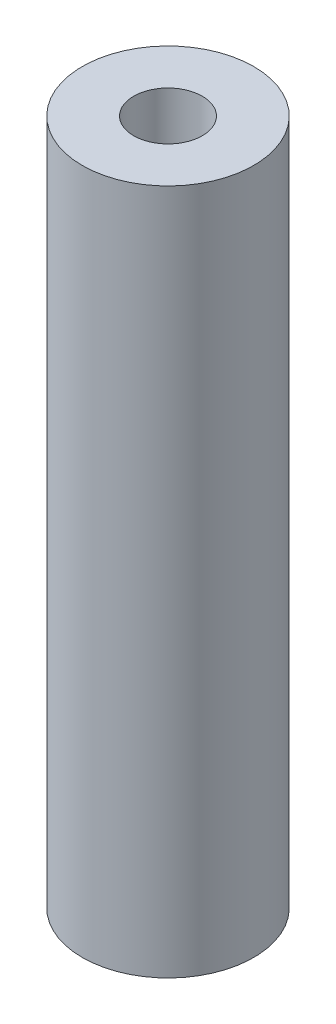
ISO-10303-21;
HEADER;
FILE_DESCRIPTION(('STEP AP214'),'2;1');
FILE_NAME('part.step','',(''),(''),'','','');
FILE_SCHEMA(('AUTOMOTIVE_DESIGN { 1 0 10303 214 1 1 1 1 }'));
ENDSEC;
DATA;
#1=APPLICATION_CONTEXT('core data for automotive mechanical design processes');
#2=APPLICATION_PROTOCOL_DEFINITION('international standard','automotive_design',2000,#1);
#3=PRODUCT_CONTEXT('',#1,'mechanical');
#4=PRODUCT('Part','Part','',(#3));
#5=PRODUCT_RELATED_PRODUCT_CATEGORY('part','',(#4));
#6=PRODUCT_DEFINITION_FORMATION('','',#4);
#7=PRODUCT_DEFINITION_CONTEXT('part definition',#1,'design');
#8=PRODUCT_DEFINITION('design','',#6,#7);
#9=PRODUCT_DEFINITION_SHAPE('','',#8);
#10=(LENGTH_UNIT() NAMED_UNIT(*) SI_UNIT(.MILLI.,.METRE.));
#11=(NAMED_UNIT(*) PLANE_ANGLE_UNIT() SI_UNIT($,.RADIAN.));
#12=(NAMED_UNIT(*) SI_UNIT($,.STERADIAN.) SOLID_ANGLE_UNIT());
#13=UNCERTAINTY_MEASURE_WITH_UNIT(LENGTH_MEASURE(1.E-05),#10,'distance_accuracy_value','');
#14=(GEOMETRIC_REPRESENTATION_CONTEXT(3) GLOBAL_UNCERTAINTY_ASSIGNED_CONTEXT((#13)) GLOBAL_UNIT_ASSIGNED_CONTEXT((#10,
#11,#12)) REPRESENTATION_CONTEXT('',''));
#15=CARTESIAN_POINT('',(0.,0.,0.));
#16=DIRECTION('',(0.,0.,1.));
#17=DIRECTION('',(1.,0.,0.));
#18=AXIS2_PLACEMENT_3D('',#15,#16,#17);
#19=CARTESIAN_POINT('',(0.,10.,0.));
#20=DIRECTION('',(0.,1.,0.));
#21=DIRECTION('',(0.,0.,1.));
#22=AXIS2_PLACEMENT_3D('',#19,#20,#21);
#23=PLANE('',#22);
#24=CARTESIAN_POINT('',(0.,10.,0.));
#25=DIRECTION('',(0.,1.,0.));
#26=DIRECTION('',(0.,0.,1.));
#27=AXIS2_PLACEMENT_3D('',#24,#25,#26);
#28=CIRCLE('',#27,2.5);
#29=CARTESIAN_POINT('',(0.,10.,2.5));
#30=VERTEX_POINT('',#29);
#31=EDGE_CURVE('E10',#30,#30,#28,.T.);
#32=ORIENTED_EDGE('',*,*,#31,.T.);
#33=EDGE_LOOP('',(#32));
#34=FACE_BOUND('',#33,.T.);
#35=CARTESIAN_POINT('',(0.,10.,0.));
#36=DIRECTION('',(0.,1.,0.));
#37=DIRECTION('',(0.,0.,1.));
#38=AXIS2_PLACEMENT_3D('',#35,#36,#37);
#39=CIRCLE('',#38,1.);
#40=CARTESIAN_POINT('',(0.,10.,1.));
#41=VERTEX_POINT('',#40);
#42=EDGE_CURVE('E50',#41,#41,#39,.T.);
#43=ORIENTED_EDGE('',*,*,#42,.F.);
#44=EDGE_LOOP('',(#43));
#45=FACE_BOUND('',#44,.T.);
#46=ADVANCED_FACE('F37',(#34,#45),#23,.T.);
#47=CARTESIAN_POINT('',(0.,-10.,0.));
#48=DIRECTION('',(0.,1.,0.));
#49=DIRECTION('',(0.,0.,1.));
#50=AXIS2_PLACEMENT_3D('',#47,#48,#49);
#51=PLANE('',#50);
#52=CARTESIAN_POINT('',(0.,-10.,0.));
#53=DIRECTION('',(0.,1.,0.));
#54=DIRECTION('',(0.,0.,1.));
#55=AXIS2_PLACEMENT_3D('',#52,#53,#54);
#56=CIRCLE('',#55,2.5);
#57=CARTESIAN_POINT('',(0.,-10.,2.5));
#58=VERTEX_POINT('',#57);
#59=EDGE_CURVE('E41',#58,#58,#56,.T.);
#60=ORIENTED_EDGE('',*,*,#59,.F.);
#61=EDGE_LOOP('',(#60));
#62=FACE_BOUND('',#61,.T.);
#63=CARTESIAN_POINT('',(0.,-10.,0.));
#64=DIRECTION('',(0.,1.,0.));
#65=DIRECTION('',(0.,0.,1.));
#66=AXIS2_PLACEMENT_3D('',#63,#64,#65);
#67=CIRCLE('',#66,1.);
#68=CARTESIAN_POINT('',(0.,-10.,1.));
#69=VERTEX_POINT('',#68);
#70=EDGE_CURVE('E52',#69,#69,#67,.T.);
#71=ORIENTED_EDGE('',*,*,#70,.T.);
#72=EDGE_LOOP('',(#71));
#73=FACE_BOUND('',#72,.T.);
#74=ADVANCED_FACE('F64',(#62,#73),#51,.F.);
#75=CARTESIAN_POINT('',(0.,10.,0.));
#76=DIRECTION('',(0.,-1.,0.));
#77=DIRECTION('',(0.,0.,-1.));
#78=AXIS2_PLACEMENT_3D('',#75,#76,#77);
#79=CYLINDRICAL_SURFACE('',#78,2.5);
#80=ORIENTED_EDGE('',*,*,#31,.F.);
#81=EDGE_LOOP('',(#80));
#82=FACE_BOUND('',#81,.T.);
#83=ORIENTED_EDGE('',*,*,#59,.T.);
#84=EDGE_LOOP('',(#83));
#85=FACE_BOUND('',#84,.T.);
#86=ADVANCED_FACE('F39',(#82,#85),#79,.T.);
#87=CARTESIAN_POINT('',(0.,10.,0.));
#88=DIRECTION('',(0.,-1.,0.));
#89=DIRECTION('',(0.,0.,-1.));
#90=AXIS2_PLACEMENT_3D('',#87,#88,#89);
#91=CYLINDRICAL_SURFACE('',#90,1.);
#92=ORIENTED_EDGE('',*,*,#42,.T.);
#93=EDGE_LOOP('',(#92));
#94=FACE_BOUND('',#93,.T.);
#95=ORIENTED_EDGE('',*,*,#70,.F.);
#96=EDGE_LOOP('',(#95));
#97=FACE_BOUND('',#96,.T.);
#98=ADVANCED_FACE('F60',(#94,#97),#91,.F.);
#99=CLOSED_SHELL('',(#46,#74,#86,#98));
#100=MANIFOLD_SOLID_BREP('B2',#99);
#101=ADVANCED_BREP_SHAPE_REPRESENTATION('',(#18,#100),#14);
#102=SHAPE_DEFINITION_REPRESENTATION(#9,#101);
ENDSEC;
END-ISO-10303-21;
